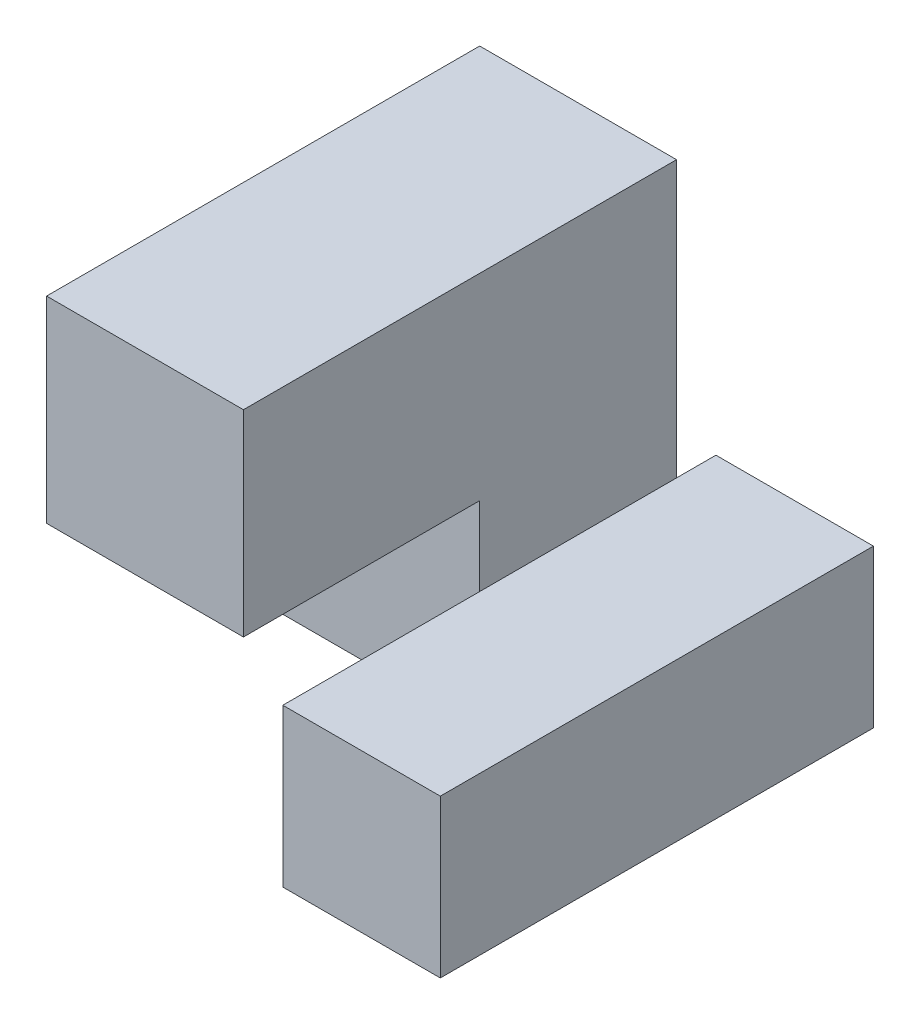
ISO-10303-21;
HEADER;
FILE_DESCRIPTION(('STEP AP214'),'2;1');
FILE_NAME('part.step','',(''),(''),'','','');
FILE_SCHEMA(('AUTOMOTIVE_DESIGN { 1 0 10303 214 1 1 1 1 }'));
ENDSEC;
DATA;
#1=APPLICATION_CONTEXT('core data for automotive mechanical design processes');
#2=APPLICATION_PROTOCOL_DEFINITION('international standard','automotive_design',2000,#1);
#3=PRODUCT_CONTEXT('',#1,'mechanical');
#4=PRODUCT('Part','Part','',(#3));
#5=PRODUCT_RELATED_PRODUCT_CATEGORY('part','',(#4));
#6=PRODUCT_DEFINITION_FORMATION('','',#4);
#7=PRODUCT_DEFINITION_CONTEXT('part definition',#1,'design');
#8=PRODUCT_DEFINITION('design','',#6,#7);
#9=PRODUCT_DEFINITION_SHAPE('','',#8);
#10=(LENGTH_UNIT() NAMED_UNIT(*) SI_UNIT(.MILLI.,.METRE.));
#11=(NAMED_UNIT(*) PLANE_ANGLE_UNIT() SI_UNIT($,.RADIAN.));
#12=(NAMED_UNIT(*) SI_UNIT($,.STERADIAN.) SOLID_ANGLE_UNIT());
#13=UNCERTAINTY_MEASURE_WITH_UNIT(LENGTH_MEASURE(1.E-05),#10,'distance_accuracy_value','');
#14=(GEOMETRIC_REPRESENTATION_CONTEXT(3) GLOBAL_UNCERTAINTY_ASSIGNED_CONTEXT((#13)) GLOBAL_UNIT_ASSIGNED_CONTEXT((#10,
#11,#12)) REPRESENTATION_CONTEXT('',''));
#15=CARTESIAN_POINT('',(0.,0.,0.));
#16=DIRECTION('',(0.,0.,1.));
#17=DIRECTION('',(1.,0.,0.));
#18=AXIS2_PLACEMENT_3D('',#15,#16,#17);
#19=CARTESIAN_POINT('',(12.,0.,22.));
#20=DIRECTION('',(1.,0.,0.));
#21=DIRECTION('',(0.,0.,-1.));
#22=AXIS2_PLACEMENT_3D('',#19,#20,#21);
#23=PLANE('',#22);
#24=DIRECTION('',(0.,-1.,0.));
#25=VECTOR('',#24,1.);
#26=CARTESIAN_POINT('',(12.,0.,0.));
#27=LINE('',#26,#25);
#28=CARTESIAN_POINT('',(12.,8.,0.));
#29=VERTEX_POINT('',#28);
#30=CARTESIAN_POINT('',(12.,0.,0.));
#31=VERTEX_POINT('',#30);
#32=EDGE_CURVE('E110',#29,#31,#27,.T.);
#33=ORIENTED_EDGE('',*,*,#32,.T.);
#34=DIRECTION('',(0.,0.,-1.));
#35=VECTOR('',#34,1.);
#36=CARTESIAN_POINT('',(12.,0.,22.));
#37=LINE('',#36,#35);
#38=CARTESIAN_POINT('',(12.,0.,22.));
#39=VERTEX_POINT('',#38);
#40=EDGE_CURVE('E12',#39,#31,#37,.T.);
#41=ORIENTED_EDGE('',*,*,#40,.F.);
#42=DIRECTION('',(0.,-1.,0.));
#43=VECTOR('',#42,1.);
#44=CARTESIAN_POINT('',(12.,0.,22.));
#45=LINE('',#44,#43);
#46=CARTESIAN_POINT('',(12.,8.,22.));
#47=VERTEX_POINT('',#46);
#48=EDGE_CURVE('E98',#47,#39,#45,.T.);
#49=ORIENTED_EDGE('',*,*,#48,.F.);
#50=DIRECTION('',(0.,0.,-1.));
#51=VECTOR('',#50,1.);
#52=CARTESIAN_POINT('',(12.,8.,22.));
#53=LINE('',#52,#51);
#54=EDGE_CURVE('E106',#47,#29,#53,.T.);
#55=ORIENTED_EDGE('',*,*,#54,.T.);
#56=EDGE_LOOP('',(#33,#41,#49,#55));
#57=FACE_BOUND('',#56,.T.);
#58=ADVANCED_FACE('F47',(#57),#23,.F.);
#59=CARTESIAN_POINT('',(12.,0.,22.));
#60=DIRECTION('',(0.,1.,0.));
#61=DIRECTION('',(0.,0.,1.));
#62=AXIS2_PLACEMENT_3D('',#59,#60,#61);
#63=PLANE('',#62);
#64=DIRECTION('',(1.,0.,0.));
#65=VECTOR('',#64,1.);
#66=CARTESIAN_POINT('',(12.,0.,0.));
#67=LINE('',#66,#65);
#68=CARTESIAN_POINT('',(20.,0.,0.));
#69=VERTEX_POINT('',#68);
#70=EDGE_CURVE('E102',#31,#69,#67,.T.);
#71=ORIENTED_EDGE('',*,*,#70,.T.);
#72=DIRECTION('',(0.,0.,-1.));
#73=VECTOR('',#72,1.);
#74=CARTESIAN_POINT('',(20.,0.,22.));
#75=LINE('',#74,#73);
#76=CARTESIAN_POINT('',(20.,0.,22.));
#77=VERTEX_POINT('',#76);
#78=EDGE_CURVE('E55',#77,#69,#75,.T.);
#79=ORIENTED_EDGE('',*,*,#78,.F.);
#80=DIRECTION('',(1.,0.,0.));
#81=VECTOR('',#80,1.);
#82=CARTESIAN_POINT('',(12.,0.,22.));
#83=LINE('',#82,#81);
#84=EDGE_CURVE('E93',#39,#77,#83,.T.);
#85=ORIENTED_EDGE('',*,*,#84,.F.);
#86=ORIENTED_EDGE('',*,*,#40,.T.);
#87=EDGE_LOOP('',(#71,#79,#85,#86));
#88=FACE_BOUND('',#87,.T.);
#89=ADVANCED_FACE('F101',(#88),#63,.F.);
#90=CARTESIAN_POINT('',(20.,0.,22.));
#91=DIRECTION('',(-1.,0.,0.));
#92=DIRECTION('',(0.,0.,1.));
#93=AXIS2_PLACEMENT_3D('',#90,#91,#92);
#94=PLANE('',#93);
#95=DIRECTION('',(0.,1.,0.));
#96=VECTOR('',#95,1.);
#97=CARTESIAN_POINT('',(20.,0.,0.));
#98=LINE('',#97,#96);
#99=CARTESIAN_POINT('',(20.,8.,0.));
#100=VERTEX_POINT('',#99);
#101=EDGE_CURVE('E80',#69,#100,#98,.T.);
#102=ORIENTED_EDGE('',*,*,#101,.T.);
#103=DIRECTION('',(0.,0.,-1.));
#104=VECTOR('',#103,1.);
#105=CARTESIAN_POINT('',(20.,8.,22.));
#106=LINE('',#105,#104);
#107=CARTESIAN_POINT('',(20.,8.,22.));
#108=VERTEX_POINT('',#107);
#109=EDGE_CURVE('E103',#108,#100,#106,.T.);
#110=ORIENTED_EDGE('',*,*,#109,.F.);
#111=DIRECTION('',(0.,1.,0.));
#112=VECTOR('',#111,1.);
#113=CARTESIAN_POINT('',(20.,0.,22.));
#114=LINE('',#113,#112);
#115=EDGE_CURVE('E96',#77,#108,#114,.T.);
#116=ORIENTED_EDGE('',*,*,#115,.F.);
#117=ORIENTED_EDGE('',*,*,#78,.T.);
#118=EDGE_LOOP('',(#102,#110,#116,#117));
#119=FACE_BOUND('',#118,.T.);
#120=ADVANCED_FACE('F104',(#119),#94,.F.);
#121=CARTESIAN_POINT('',(12.,8.,22.));
#122=DIRECTION('',(0.,-1.,0.));
#123=DIRECTION('',(0.,0.,-1.));
#124=AXIS2_PLACEMENT_3D('',#121,#122,#123);
#125=PLANE('',#124);
#126=DIRECTION('',(-1.,0.,0.));
#127=VECTOR('',#126,1.);
#128=CARTESIAN_POINT('',(12.,8.,0.));
#129=LINE('',#128,#127);
#130=EDGE_CURVE('E86',#100,#29,#129,.T.);
#131=ORIENTED_EDGE('',*,*,#130,.T.);
#132=ORIENTED_EDGE('',*,*,#54,.F.);
#133=DIRECTION('',(-1.,0.,0.));
#134=VECTOR('',#133,1.);
#135=CARTESIAN_POINT('',(12.,8.,22.));
#136=LINE('',#135,#134);
#137=EDGE_CURVE('E63',#108,#47,#136,.T.);
#138=ORIENTED_EDGE('',*,*,#137,.F.);
#139=ORIENTED_EDGE('',*,*,#109,.T.);
#140=EDGE_LOOP('',(#131,#132,#138,#139));
#141=FACE_BOUND('',#140,.T.);
#142=ADVANCED_FACE('F117',(#141),#125,.F.);
#143=CARTESIAN_POINT('',(0.,0.,22.));
#144=DIRECTION('',(0.,0.,-1.));
#145=DIRECTION('',(-1.,0.,0.));
#146=AXIS2_PLACEMENT_3D('',#143,#144,#145);
#147=PLANE('',#146);
#148=ORIENTED_EDGE('',*,*,#48,.T.);
#149=ORIENTED_EDGE('',*,*,#84,.T.);
#150=ORIENTED_EDGE('',*,*,#115,.T.);
#151=ORIENTED_EDGE('',*,*,#137,.T.);
#152=EDGE_LOOP('',(#148,#149,#150,#151));
#153=FACE_BOUND('',#152,.T.);
#154=ADVANCED_FACE('F94',(#153),#147,.F.);
#155=CARTESIAN_POINT('',(0.,0.,0.));
#156=DIRECTION('',(0.,0.,-1.));
#157=DIRECTION('',(-1.,0.,0.));
#158=AXIS2_PLACEMENT_3D('',#155,#156,#157);
#159=PLANE('',#158);
#160=ORIENTED_EDGE('',*,*,#32,.F.);
#161=ORIENTED_EDGE('',*,*,#130,.F.);
#162=ORIENTED_EDGE('',*,*,#101,.F.);
#163=ORIENTED_EDGE('',*,*,#70,.F.);
#164=EDGE_LOOP('',(#160,#161,#162,#163));
#165=FACE_BOUND('',#164,.T.);
#166=ADVANCED_FACE('F120',(#165),#159,.T.);
#167=CLOSED_SHELL('',(#58,#89,#120,#142,#154,#166));
#168=MANIFOLD_SOLID_BREP('B2',#167);
#169=CARTESIAN_POINT('',(0.,0.,10.));
#170=DIRECTION('',(0.,0.,-1.));
#171=DIRECTION('',(-1.,0.,0.));
#172=AXIS2_PLACEMENT_3D('',#169,#170,#171);
#173=PLANE('',#172);
#174=DIRECTION('',(1.,0.,0.));
#175=VECTOR('',#174,1.);
#176=CARTESIAN_POINT('',(0.,10.,10.));
#177=LINE('',#176,#175);
#178=CARTESIAN_POINT('',(0.,10.,10.));
#179=VERTEX_POINT('',#178);
#180=CARTESIAN_POINT('',(10.,10.,10.));
#181=VERTEX_POINT('',#180);
#182=EDGE_CURVE('E190',#179,#181,#177,.T.);
#183=ORIENTED_EDGE('',*,*,#182,.F.);
#184=DIRECTION('',(0.,-1.,0.));
#185=VECTOR('',#184,1.);
#186=CARTESIAN_POINT('',(0.,0.,10.));
#187=LINE('',#186,#185);
#188=CARTESIAN_POINT('',(0.,0.,10.));
#189=VERTEX_POINT('',#188);
#190=EDGE_CURVE('E244',#179,#189,#187,.T.);
#191=ORIENTED_EDGE('',*,*,#190,.T.);
#192=DIRECTION('',(1.,0.,0.));
#193=VECTOR('',#192,1.);
#194=CARTESIAN_POINT('',(0.,0.,10.));
#195=LINE('',#194,#193);
#196=CARTESIAN_POINT('',(10.,0.,10.));
#197=VERTEX_POINT('',#196);
#198=EDGE_CURVE('E252',#189,#197,#195,.T.);
#199=ORIENTED_EDGE('',*,*,#198,.T.);
#200=DIRECTION('',(0.,1.,0.));
#201=VECTOR('',#200,1.);
#202=CARTESIAN_POINT('',(10.,0.,10.));
#203=LINE('',#202,#201);
#204=EDGE_CURVE('E186',#197,#181,#203,.T.);
#205=ORIENTED_EDGE('',*,*,#204,.T.);
#206=EDGE_LOOP('',(#183,#191,#199,#205));
#207=FACE_BOUND('',#206,.T.);
#208=ADVANCED_FACE('F171',(#207),#173,.F.);
#209=CARTESIAN_POINT('',(0.,0.,10.));
#210=DIRECTION('',(1.,0.,0.));
#211=DIRECTION('',(0.,0.,-1.));
#212=AXIS2_PLACEMENT_3D('',#209,#210,#211);
#213=PLANE('',#212);
#214=DIRECTION('',(0.,-1.,0.));
#215=VECTOR('',#214,1.);
#216=CARTESIAN_POINT('',(0.,0.,0.));
#217=LINE('',#216,#215);
#218=CARTESIAN_POINT('',(0.,20.,0.));
#219=VERTEX_POINT('',#218);
#220=CARTESIAN_POINT('',(0.,0.,0.));
#221=VERTEX_POINT('',#220);
#222=EDGE_CURVE('E246',#219,#221,#217,.T.);
#223=ORIENTED_EDGE('',*,*,#222,.T.);
#224=DIRECTION('',(0.,0.,-1.));
#225=VECTOR('',#224,1.);
#226=CARTESIAN_POINT('',(0.,0.,10.));
#227=LINE('',#226,#225);
#228=EDGE_CURVE('E45',#189,#221,#227,.T.);
#229=ORIENTED_EDGE('',*,*,#228,.F.);
#230=ORIENTED_EDGE('',*,*,#190,.F.);
#231=DIRECTION('',(0.,0.,-1.));
#232=VECTOR('',#231,1.);
#233=CARTESIAN_POINT('',(0.,10.,22.));
#234=LINE('',#233,#232);
#235=CARTESIAN_POINT('',(0.,10.,22.));
#236=VERTEX_POINT('',#235);
#237=EDGE_CURVE('E226',#236,#179,#234,.T.);
#238=ORIENTED_EDGE('',*,*,#237,.F.);
#239=DIRECTION('',(0.,-1.,0.));
#240=VECTOR('',#239,1.);
#241=CARTESIAN_POINT('',(0.,10.,22.));
#242=LINE('',#241,#240);
#243=CARTESIAN_POINT('',(0.,20.,22.));
#244=VERTEX_POINT('',#243);
#245=EDGE_CURVE('E233',#244,#236,#242,.T.);
#246=ORIENTED_EDGE('',*,*,#245,.F.);
#247=DIRECTION('',(0.,0.,-1.));
#248=VECTOR('',#247,1.);
#249=CARTESIAN_POINT('',(0.,20.,10.));
#250=LINE('',#249,#248);
#251=EDGE_CURVE('E256',#244,#219,#250,.T.);
#252=ORIENTED_EDGE('',*,*,#251,.T.);
#253=EDGE_LOOP('',(#223,#229,#230,#238,#246,#252));
#254=FACE_BOUND('',#253,.T.);
#255=ADVANCED_FACE('F173',(#254),#213,.F.);
#256=CARTESIAN_POINT('',(0.,0.,10.));
#257=DIRECTION('',(0.,1.,0.));
#258=DIRECTION('',(0.,0.,1.));
#259=AXIS2_PLACEMENT_3D('',#256,#257,#258);
#260=PLANE('',#259);
#261=DIRECTION('',(1.,0.,0.));
#262=VECTOR('',#261,1.);
#263=CARTESIAN_POINT('',(0.,0.,0.));
#264=LINE('',#263,#262);
#265=CARTESIAN_POINT('',(10.,0.,0.));
#266=VERTEX_POINT('',#265);
#267=EDGE_CURVE('E258',#221,#266,#264,.T.);
#268=ORIENTED_EDGE('',*,*,#267,.T.);
#269=DIRECTION('',(0.,0.,-1.));
#270=VECTOR('',#269,1.);
#271=CARTESIAN_POINT('',(10.,0.,10.));
#272=LINE('',#271,#270);
#273=EDGE_CURVE('E179',#197,#266,#272,.T.);
#274=ORIENTED_EDGE('',*,*,#273,.F.);
#275=ORIENTED_EDGE('',*,*,#198,.F.);
#276=ORIENTED_EDGE('',*,*,#228,.T.);
#277=EDGE_LOOP('',(#268,#274,#275,#276));
#278=FACE_BOUND('',#277,.T.);
#279=ADVANCED_FACE('F280',(#278),#260,.F.);
#280=CARTESIAN_POINT('',(10.,0.,10.));
#281=DIRECTION('',(-1.,0.,0.));
#282=DIRECTION('',(0.,0.,1.));
#283=AXIS2_PLACEMENT_3D('',#280,#281,#282);
#284=PLANE('',#283);
#285=DIRECTION('',(0.,0.,-1.));
#286=VECTOR('',#285,1.);
#287=CARTESIAN_POINT('',(10.,20.,10.));
#288=LINE('',#287,#286);
#289=CARTESIAN_POINT('',(10.,20.,22.));
#290=VERTEX_POINT('',#289);
#291=CARTESIAN_POINT('',(10.,20.,0.));
#292=VERTEX_POINT('',#291);
#293=EDGE_CURVE('E264',#290,#292,#288,.T.);
#294=ORIENTED_EDGE('',*,*,#293,.F.);
#295=DIRECTION('',(0.,1.,0.));
#296=VECTOR('',#295,1.);
#297=CARTESIAN_POINT('',(10.,10.,22.));
#298=LINE('',#297,#296);
#299=CARTESIAN_POINT('',(10.,10.,22.));
#300=VERTEX_POINT('',#299);
#301=EDGE_CURVE('E232',#300,#290,#298,.T.);
#302=ORIENTED_EDGE('',*,*,#301,.F.);
#303=DIRECTION('',(0.,0.,-1.));
#304=VECTOR('',#303,1.);
#305=CARTESIAN_POINT('',(10.,10.,22.));
#306=LINE('',#305,#304);
#307=EDGE_CURVE('E228',#300,#181,#306,.T.);
#308=ORIENTED_EDGE('',*,*,#307,.T.);
#309=ORIENTED_EDGE('',*,*,#204,.F.);
#310=ORIENTED_EDGE('',*,*,#273,.T.);
#311=DIRECTION('',(0.,1.,0.));
#312=VECTOR('',#311,1.);
#313=CARTESIAN_POINT('',(10.,0.,0.));
#314=LINE('',#313,#312);
#315=EDGE_CURVE('E260',#266,#292,#314,.T.);
#316=ORIENTED_EDGE('',*,*,#315,.T.);
#317=EDGE_LOOP('',(#294,#302,#308,#309,#310,#316));
#318=FACE_BOUND('',#317,.T.);
#319=ADVANCED_FACE('F270',(#318),#284,.F.);
#320=CARTESIAN_POINT('',(0.,20.,10.));
#321=DIRECTION('',(0.,-1.,0.));
#322=DIRECTION('',(0.,0.,-1.));
#323=AXIS2_PLACEMENT_3D('',#320,#321,#322);
#324=PLANE('',#323);
#325=DIRECTION('',(-1.,0.,0.));
#326=VECTOR('',#325,1.);
#327=CARTESIAN_POINT('',(0.,20.,0.));
#328=LINE('',#327,#326);
#329=EDGE_CURVE('E253',#292,#219,#328,.T.);
#330=ORIENTED_EDGE('',*,*,#329,.T.);
#331=ORIENTED_EDGE('',*,*,#251,.F.);
#332=DIRECTION('',(-1.,0.,0.));
#333=VECTOR('',#332,1.);
#334=CARTESIAN_POINT('',(0.,20.,22.));
#335=LINE('',#334,#333);
#336=EDGE_CURVE('E239',#290,#244,#335,.T.);
#337=ORIENTED_EDGE('',*,*,#336,.F.);
#338=ORIENTED_EDGE('',*,*,#293,.T.);
#339=EDGE_LOOP('',(#330,#331,#337,#338));
#340=FACE_BOUND('',#339,.T.);
#341=ADVANCED_FACE('F279',(#340),#324,.F.);
#342=CARTESIAN_POINT('',(0.,0.,0.));
#343=DIRECTION('',(0.,0.,-1.));
#344=DIRECTION('',(-1.,0.,0.));
#345=AXIS2_PLACEMENT_3D('',#342,#343,#344);
#346=PLANE('',#345);
#347=ORIENTED_EDGE('',*,*,#329,.F.);
#348=ORIENTED_EDGE('',*,*,#315,.F.);
#349=ORIENTED_EDGE('',*,*,#267,.F.);
#350=ORIENTED_EDGE('',*,*,#222,.F.);
#351=EDGE_LOOP('',(#347,#348,#349,#350));
#352=FACE_BOUND('',#351,.T.);
#353=ADVANCED_FACE('F276',(#352),#346,.T.);
#354=CARTESIAN_POINT('',(0.,10.,22.));
#355=DIRECTION('',(0.,1.,0.));
#356=DIRECTION('',(0.,0.,1.));
#357=AXIS2_PLACEMENT_3D('',#354,#355,#356);
#358=PLANE('',#357);
#359=ORIENTED_EDGE('',*,*,#237,.T.);
#360=ORIENTED_EDGE('',*,*,#182,.T.);
#361=ORIENTED_EDGE('',*,*,#307,.F.);
#362=DIRECTION('',(1.,0.,0.));
#363=VECTOR('',#362,1.);
#364=CARTESIAN_POINT('',(0.,10.,22.));
#365=LINE('',#364,#363);
#366=EDGE_CURVE('E222',#236,#300,#365,.T.);
#367=ORIENTED_EDGE('',*,*,#366,.F.);
#368=EDGE_LOOP('',(#359,#360,#361,#367));
#369=FACE_BOUND('',#368,.T.);
#370=ADVANCED_FACE('F224',(#369),#358,.F.);
#371=CARTESIAN_POINT('',(0.,0.,22.));
#372=DIRECTION('',(0.,0.,-1.));
#373=DIRECTION('',(-1.,0.,0.));
#374=AXIS2_PLACEMENT_3D('',#371,#372,#373);
#375=PLANE('',#374);
#376=ORIENTED_EDGE('',*,*,#245,.T.);
#377=ORIENTED_EDGE('',*,*,#366,.T.);
#378=ORIENTED_EDGE('',*,*,#301,.T.);
#379=ORIENTED_EDGE('',*,*,#336,.T.);
#380=EDGE_LOOP('',(#376,#377,#378,#379));
#381=FACE_BOUND('',#380,.T.);
#382=ADVANCED_FACE('F237',(#381),#375,.F.);
#383=CLOSED_SHELL('',(#208,#255,#279,#319,#341,#353,#370,#382));
#384=MANIFOLD_SOLID_BREP('B6',#383);
#385=ADVANCED_BREP_SHAPE_REPRESENTATION('',(#18,#168,#384),#14);
#386=SHAPE_DEFINITION_REPRESENTATION(#9,#385);
ENDSEC;
END-ISO-10303-21;
